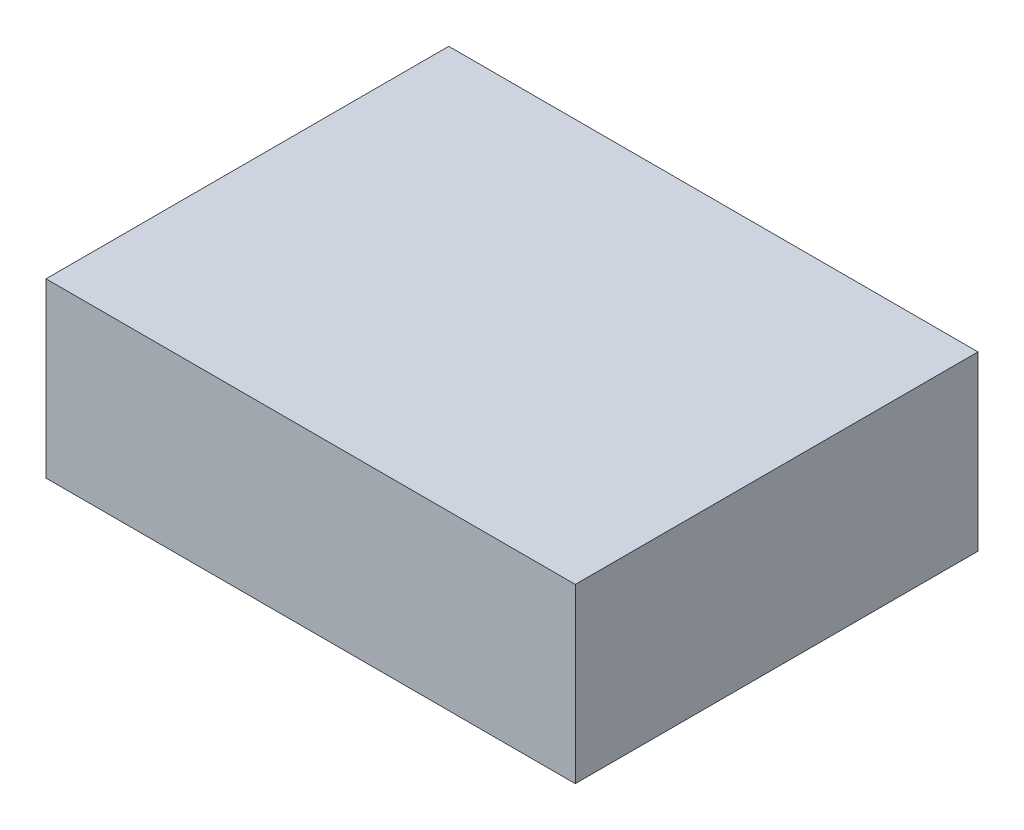
ISO-10303-21;
HEADER;
FILE_DESCRIPTION(('STEP AP214'),'2;1');
FILE_NAME('part.step','',(''),(''),'','','');
FILE_SCHEMA(('AUTOMOTIVE_DESIGN { 1 0 10303 214 1 1 1 1 }'));
ENDSEC;
DATA;
#1=APPLICATION_CONTEXT('core data for automotive mechanical design processes');
#2=APPLICATION_PROTOCOL_DEFINITION('international standard','automotive_design',2000,#1);
#3=PRODUCT_CONTEXT('',#1,'mechanical');
#4=PRODUCT('Part','Part','',(#3));
#5=PRODUCT_RELATED_PRODUCT_CATEGORY('part','',(#4));
#6=PRODUCT_DEFINITION_FORMATION('','',#4);
#7=PRODUCT_DEFINITION_CONTEXT('part definition',#1,'design');
#8=PRODUCT_DEFINITION('design','',#6,#7);
#9=PRODUCT_DEFINITION_SHAPE('','',#8);
#10=(LENGTH_UNIT() NAMED_UNIT(*) SI_UNIT(.MILLI.,.METRE.));
#11=(NAMED_UNIT(*) PLANE_ANGLE_UNIT() SI_UNIT($,.RADIAN.));
#12=(NAMED_UNIT(*) SI_UNIT($,.STERADIAN.) SOLID_ANGLE_UNIT());
#13=UNCERTAINTY_MEASURE_WITH_UNIT(LENGTH_MEASURE(1.E-05),#10,'distance_accuracy_value','');
#14=(GEOMETRIC_REPRESENTATION_CONTEXT(3) GLOBAL_UNCERTAINTY_ASSIGNED_CONTEXT((#13)) GLOBAL_UNIT_ASSIGNED_CONTEXT((#10,
#11,#12)) REPRESENTATION_CONTEXT('',''));
#15=CARTESIAN_POINT('',(0.,0.,0.));
#16=DIRECTION('',(0.,0.,1.));
#17=DIRECTION('',(1.,0.,0.));
#18=AXIS2_PLACEMENT_3D('',#15,#16,#17);
#19=CARTESIAN_POINT('',(23.,15.,-17.5));
#20=DIRECTION('',(-1.,0.,0.));
#21=DIRECTION('',(0.,0.,1.));
#22=AXIS2_PLACEMENT_3D('',#19,#20,#21);
#23=PLANE('',#22);
#24=DIRECTION('',(0.,0.,-1.));
#25=VECTOR('',#24,1.);
#26=CARTESIAN_POINT('',(23.,0.,-17.5));
#27=LINE('',#26,#25);
#28=CARTESIAN_POINT('',(23.,0.,17.5));
#29=VERTEX_POINT('',#28);
#30=CARTESIAN_POINT('',(23.,0.,-17.5));
#31=VERTEX_POINT('',#30);
#32=EDGE_CURVE('E95',#29,#31,#27,.T.);
#33=ORIENTED_EDGE('',*,*,#32,.T.);
#34=DIRECTION('',(0.,-1.,0.));
#35=VECTOR('',#34,1.);
#36=CARTESIAN_POINT('',(23.,15.,-17.5));
#37=LINE('',#36,#35);
#38=CARTESIAN_POINT('',(23.,15.,-17.5));
#39=VERTEX_POINT('',#38);
#40=EDGE_CURVE('E11',#39,#31,#37,.T.);
#41=ORIENTED_EDGE('',*,*,#40,.F.);
#42=DIRECTION('',(0.,0.,-1.));
#43=VECTOR('',#42,1.);
#44=CARTESIAN_POINT('',(23.,15.,-17.5));
#45=LINE('',#44,#43);
#46=CARTESIAN_POINT('',(23.,15.,17.5));
#47=VERTEX_POINT('',#46);
#48=EDGE_CURVE('E83',#47,#39,#45,.T.);
#49=ORIENTED_EDGE('',*,*,#48,.F.);
#50=DIRECTION('',(0.,-1.,0.));
#51=VECTOR('',#50,1.);
#52=CARTESIAN_POINT('',(23.,15.,17.5));
#53=LINE('',#52,#51);
#54=EDGE_CURVE('E91',#47,#29,#53,.T.);
#55=ORIENTED_EDGE('',*,*,#54,.T.);
#56=EDGE_LOOP('',(#33,#41,#49,#55));
#57=FACE_BOUND('',#56,.T.);
#58=ADVANCED_FACE('F32',(#57),#23,.F.);
#59=CARTESIAN_POINT('',(-23.,15.,-17.5));
#60=DIRECTION('',(0.,0.,1.));
#61=DIRECTION('',(1.,0.,0.));
#62=AXIS2_PLACEMENT_3D('',#59,#60,#61);
#63=PLANE('',#62);
#64=DIRECTION('',(-1.,0.,0.));
#65=VECTOR('',#64,1.);
#66=CARTESIAN_POINT('',(-23.,0.,-17.5));
#67=LINE('',#66,#65);
#68=CARTESIAN_POINT('',(-23.,0.,-17.5));
#69=VERTEX_POINT('',#68);
#70=EDGE_CURVE('E87',#31,#69,#67,.T.);
#71=ORIENTED_EDGE('',*,*,#70,.T.);
#72=DIRECTION('',(0.,-1.,0.));
#73=VECTOR('',#72,1.);
#74=CARTESIAN_POINT('',(-23.,15.,-17.5));
#75=LINE('',#74,#73);
#76=CARTESIAN_POINT('',(-23.,15.,-17.5));
#77=VERTEX_POINT('',#76);
#78=EDGE_CURVE('E40',#77,#69,#75,.T.);
#79=ORIENTED_EDGE('',*,*,#78,.F.);
#80=DIRECTION('',(-1.,0.,0.));
#81=VECTOR('',#80,1.);
#82=CARTESIAN_POINT('',(-23.,15.,-17.5));
#83=LINE('',#82,#81);
#84=EDGE_CURVE('E78',#39,#77,#83,.T.);
#85=ORIENTED_EDGE('',*,*,#84,.F.);
#86=ORIENTED_EDGE('',*,*,#40,.T.);
#87=EDGE_LOOP('',(#71,#79,#85,#86));
#88=FACE_BOUND('',#87,.T.);
#89=ADVANCED_FACE('F86',(#88),#63,.F.);
#90=CARTESIAN_POINT('',(-23.,15.,-17.5));
#91=DIRECTION('',(1.,0.,0.));
#92=DIRECTION('',(0.,0.,-1.));
#93=AXIS2_PLACEMENT_3D('',#90,#91,#92);
#94=PLANE('',#93);
#95=DIRECTION('',(0.,0.,1.));
#96=VECTOR('',#95,1.);
#97=CARTESIAN_POINT('',(-23.,0.,-17.5));
#98=LINE('',#97,#96);
#99=CARTESIAN_POINT('',(-23.,0.,17.5));
#100=VERTEX_POINT('',#99);
#101=EDGE_CURVE('E65',#69,#100,#98,.T.);
#102=ORIENTED_EDGE('',*,*,#101,.T.);
#103=DIRECTION('',(0.,-1.,0.));
#104=VECTOR('',#103,1.);
#105=CARTESIAN_POINT('',(-23.,15.,17.5));
#106=LINE('',#105,#104);
#107=CARTESIAN_POINT('',(-23.,15.,17.5));
#108=VERTEX_POINT('',#107);
#109=EDGE_CURVE('E88',#108,#100,#106,.T.);
#110=ORIENTED_EDGE('',*,*,#109,.F.);
#111=DIRECTION('',(0.,0.,1.));
#112=VECTOR('',#111,1.);
#113=CARTESIAN_POINT('',(-23.,15.,-17.5));
#114=LINE('',#113,#112);
#115=EDGE_CURVE('E81',#77,#108,#114,.T.);
#116=ORIENTED_EDGE('',*,*,#115,.F.);
#117=ORIENTED_EDGE('',*,*,#78,.T.);
#118=EDGE_LOOP('',(#102,#110,#116,#117));
#119=FACE_BOUND('',#118,.T.);
#120=ADVANCED_FACE('F89',(#119),#94,.F.);
#121=CARTESIAN_POINT('',(-23.,15.,17.5));
#122=DIRECTION('',(0.,0.,-1.));
#123=DIRECTION('',(-1.,0.,0.));
#124=AXIS2_PLACEMENT_3D('',#121,#122,#123);
#125=PLANE('',#124);
#126=DIRECTION('',(1.,0.,0.));
#127=VECTOR('',#126,1.);
#128=CARTESIAN_POINT('',(-23.,0.,17.5));
#129=LINE('',#128,#127);
#130=EDGE_CURVE('E71',#100,#29,#129,.T.);
#131=ORIENTED_EDGE('',*,*,#130,.T.);
#132=ORIENTED_EDGE('',*,*,#54,.F.);
#133=DIRECTION('',(1.,0.,0.));
#134=VECTOR('',#133,1.);
#135=CARTESIAN_POINT('',(-23.,15.,17.5));
#136=LINE('',#135,#134);
#137=EDGE_CURVE('E48',#108,#47,#136,.T.);
#138=ORIENTED_EDGE('',*,*,#137,.F.);
#139=ORIENTED_EDGE('',*,*,#109,.T.);
#140=EDGE_LOOP('',(#131,#132,#138,#139));
#141=FACE_BOUND('',#140,.T.);
#142=ADVANCED_FACE('F102',(#141),#125,.F.);
#143=CARTESIAN_POINT('',(0.,15.,0.));
#144=DIRECTION('',(0.,1.,0.));
#145=DIRECTION('',(0.,0.,1.));
#146=AXIS2_PLACEMENT_3D('',#143,#144,#145);
#147=PLANE('',#146);
#148=ORIENTED_EDGE('',*,*,#48,.T.);
#149=ORIENTED_EDGE('',*,*,#84,.T.);
#150=ORIENTED_EDGE('',*,*,#115,.T.);
#151=ORIENTED_EDGE('',*,*,#137,.T.);
#152=EDGE_LOOP('',(#148,#149,#150,#151));
#153=FACE_BOUND('',#152,.T.);
#154=ADVANCED_FACE('F79',(#153),#147,.T.);
#155=CARTESIAN_POINT('',(0.,0.,0.));
#156=DIRECTION('',(0.,1.,0.));
#157=DIRECTION('',(0.,0.,1.));
#158=AXIS2_PLACEMENT_3D('',#155,#156,#157);
#159=PLANE('',#158);
#160=ORIENTED_EDGE('',*,*,#32,.F.);
#161=ORIENTED_EDGE('',*,*,#130,.F.);
#162=ORIENTED_EDGE('',*,*,#101,.F.);
#163=ORIENTED_EDGE('',*,*,#70,.F.);
#164=EDGE_LOOP('',(#160,#161,#162,#163));
#165=FACE_BOUND('',#164,.T.);
#166=ADVANCED_FACE('F105',(#165),#159,.F.);
#167=CLOSED_SHELL('',(#58,#89,#120,#142,#154,#166));
#168=MANIFOLD_SOLID_BREP('B2',#167);
#169=ADVANCED_BREP_SHAPE_REPRESENTATION('',(#18,#168),#14);
#170=SHAPE_DEFINITION_REPRESENTATION(#9,#169);
ENDSEC;
END-ISO-10303-21;
